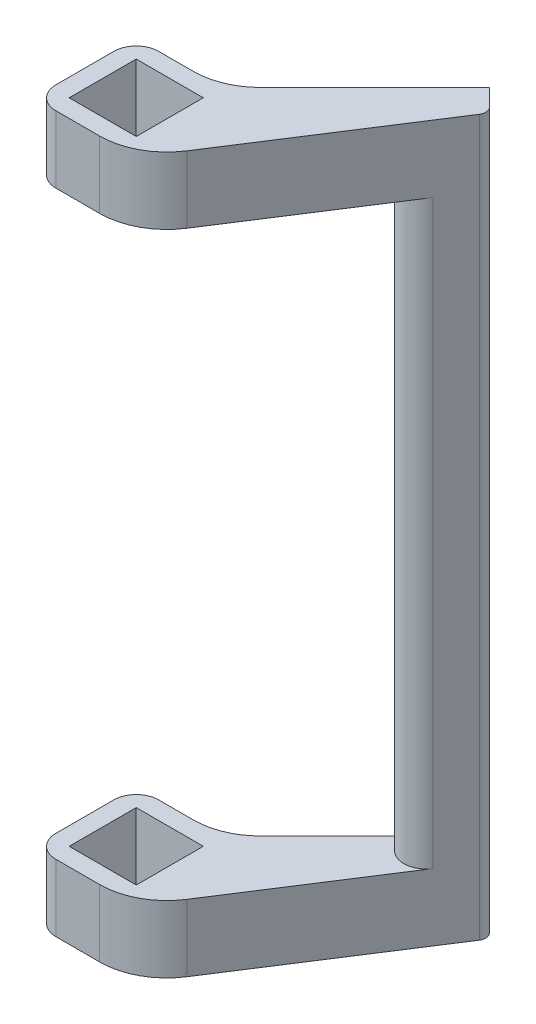
ISO-10303-21;
HEADER;
FILE_DESCRIPTION(('STEP AP214'),'2;1');
FILE_NAME('part.step','',(''),(''),'','','');
FILE_SCHEMA(('AUTOMOTIVE_DESIGN { 1 0 10303 214 1 1 1 1 }'));
ENDSEC;
DATA;
#1=APPLICATION_CONTEXT('core data for automotive mechanical design processes');
#2=APPLICATION_PROTOCOL_DEFINITION('international standard','automotive_design',2000,#1);
#3=PRODUCT_CONTEXT('',#1,'mechanical');
#4=PRODUCT('Part','Part','',(#3));
#5=PRODUCT_RELATED_PRODUCT_CATEGORY('part','',(#4));
#6=PRODUCT_DEFINITION_FORMATION('','',#4);
#7=PRODUCT_DEFINITION_CONTEXT('part definition',#1,'design');
#8=PRODUCT_DEFINITION('design','',#6,#7);
#9=PRODUCT_DEFINITION_SHAPE('','',#8);
#10=(LENGTH_UNIT() NAMED_UNIT(*) SI_UNIT(.MILLI.,.METRE.));
#11=(NAMED_UNIT(*) PLANE_ANGLE_UNIT() SI_UNIT($,.RADIAN.));
#12=(NAMED_UNIT(*) SI_UNIT($,.STERADIAN.) SOLID_ANGLE_UNIT());
#13=UNCERTAINTY_MEASURE_WITH_UNIT(LENGTH_MEASURE(1.E-05),#10,'distance_accuracy_value','');
#14=(GEOMETRIC_REPRESENTATION_CONTEXT(3) GLOBAL_UNCERTAINTY_ASSIGNED_CONTEXT((#13)) GLOBAL_UNIT_ASSIGNED_CONTEXT((#10,
#11,#12)) REPRESENTATION_CONTEXT('',''));
#15=CARTESIAN_POINT('',(0.,0.,0.));
#16=DIRECTION('',(0.,0.,1.));
#17=DIRECTION('',(1.,0.,0.));
#18=AXIS2_PLACEMENT_3D('',#15,#16,#17);
#19=CARTESIAN_POINT('',(40.3284271247369,159.,-38.6715728752495));
#20=DIRECTION('',(-0.707106781186547,0.,-0.707106781186547));
#21=DIRECTION('',(-0.707106781186548,0.,0.707106781186548));
#22=AXIS2_PLACEMENT_3D('',#19,#20,#21);
#23=PLANE('',#22);
#24=DIRECTION('',(0.,-1.,0.));
#25=VECTOR('',#24,1.);
#26=CARTESIAN_POINT('',(40.3284271247369,159.,-38.6715728752495));
#27=LINE('',#26,#25);
#28=CARTESIAN_POINT('',(40.3284271247369,145.,-38.6715728752495));
#29=VERTEX_POINT('',#28);
#30=CARTESIAN_POINT('',(40.3284271247437,15.,-38.6715728752563));
#31=VERTEX_POINT('',#30);
#32=EDGE_CURVE('E405',#29,#31,#27,.T.);
#33=ORIENTED_EDGE('',*,*,#32,.T.);
#34=DIRECTION('',(-0.707106781186548,0.,0.707106781186548));
#35=VECTOR('',#34,1.);
#36=CARTESIAN_POINT('',(40.3284271247369,15.,-38.6715728752495));
#37=LINE('',#36,#35);
#38=CARTESIAN_POINT('',(29.7218254069386,15.,-28.0649711574512));
#39=VERTEX_POINT('',#38);
#40=EDGE_CURVE('E394',#31,#39,#37,.T.);
#41=ORIENTED_EDGE('',*,*,#40,.T.);
#42=DIRECTION('',(0.,-1.,0.));
#43=VECTOR('',#42,1.);
#44=CARTESIAN_POINT('',(29.7218254069386,159.,-28.0649711574512));
#45=LINE('',#44,#43);
#46=CARTESIAN_POINT('',(29.7218254069386,145.,-28.0649711574512));
#47=VERTEX_POINT('',#46);
#48=EDGE_CURVE('E404',#47,#39,#45,.T.);
#49=ORIENTED_EDGE('',*,*,#48,.F.);
#50=DIRECTION('',(-0.707106781186548,0.,0.707106781186548));
#51=VECTOR('',#50,1.);
#52=CARTESIAN_POINT('',(20.352847396408,145.,-18.6959931469206));
#53=LINE('',#52,#51);
#54=EDGE_CURVE('E560',#29,#47,#53,.T.);
#55=ORIENTED_EDGE('',*,*,#54,.F.);
#56=EDGE_LOOP('',(#33,#41,#49,#55));
#57=FACE_BOUND('',#56,.T.);
#58=ADVANCED_FACE('F73',(#57),#23,.T.);
#59=CARTESIAN_POINT('',(29.7218254069386,159.,-28.0649711574512));
#60=DIRECTION('',(-0.707106781186549,0.,0.707106781186546));
#61=DIRECTION('',(0.707106781186546,0.,0.707106781186549));
#62=AXIS2_PLACEMENT_3D('',#59,#60,#61);
#63=PLANE('',#62);
#64=DIRECTION('',(0.707106781186546,0.,0.707106781186549));
#65=VECTOR('',#64,1.);
#66=CARTESIAN_POINT('',(29.7218254069386,15.,-28.0649711574512));
#67=LINE('',#66,#65);
#68=CARTESIAN_POINT('',(29.7563479415347,15.,-28.0304486228552));
#69=VERTEX_POINT('',#68);
#70=EDGE_CURVE('E564',#39,#69,#67,.T.);
#71=ORIENTED_EDGE('',*,*,#70,.T.);
#72=DIRECTION('',(0.,-1.,0.));
#73=VECTOR('',#72,1.);
#74=CARTESIAN_POINT('',(29.7563479415347,145.,-28.0304486228552));
#75=LINE('',#74,#73);
#76=CARTESIAN_POINT('',(29.7563479415347,145.,-28.0304486228552));
#77=VERTEX_POINT('',#76);
#78=EDGE_CURVE('E572',#69,#77,#75,.F.);
#79=ORIENTED_EDGE('',*,*,#78,.T.);
#80=DIRECTION('',(0.707106781186546,0.,0.707106781186549));
#81=VECTOR('',#80,1.);
#82=CARTESIAN_POINT('',(71.9178185538592,145.,14.1310219894695));
#83=LINE('',#82,#81);
#84=EDGE_CURVE('E556',#47,#77,#83,.T.);
#85=ORIENTED_EDGE('',*,*,#84,.F.);
#86=ORIENTED_EDGE('',*,*,#48,.T.);
#87=EDGE_LOOP('',(#71,#79,#85,#86));
#88=FACE_BOUND('',#87,.T.);
#89=ADVANCED_FACE('F668',(#88),#63,.T.);
#90=CARTESIAN_POINT('',(-11.5,160.,-11.5));
#91=DIRECTION('',(0.,0.,-1.));
#92=DIRECTION('',(-1.,0.,0.));
#93=AXIS2_PLACEMENT_3D('',#90,#91,#92);
#94=PLANE('',#93);
#95=DIRECTION('',(1.,0.,0.));
#96=VECTOR('',#95,1.);
#97=CARTESIAN_POINT('',(-11.5,160.,-11.5));
#98=LINE('',#97,#96);
#99=CARTESIAN_POINT('',(-6.5,160.,-11.5));
#100=VERTEX_POINT('',#99);
#101=CARTESIAN_POINT('',(1.28679656440358,160.,-11.5));
#102=VERTEX_POINT('',#101);
#103=EDGE_CURVE('E409',#100,#102,#98,.T.);
#104=ORIENTED_EDGE('',*,*,#103,.T.);
#105=DIRECTION('',(0.,-1.,0.));
#106=VECTOR('',#105,1.);
#107=CARTESIAN_POINT('',(1.28679656440358,145.,-11.5));
#108=LINE('',#107,#106);
#109=CARTESIAN_POINT('',(1.28679656440358,145.,-11.5));
#110=VERTEX_POINT('',#109);
#111=EDGE_CURVE('E543',#102,#110,#108,.T.);
#112=ORIENTED_EDGE('',*,*,#111,.T.);
#113=DIRECTION('',(1.,0.,0.));
#114=VECTOR('',#113,1.);
#115=CARTESIAN_POINT('',(-11.5,145.,-11.5));
#116=LINE('',#115,#114);
#117=CARTESIAN_POINT('',(-6.5,145.,-11.5));
#118=VERTEX_POINT('',#117);
#119=EDGE_CURVE('E450',#118,#110,#116,.T.);
#120=ORIENTED_EDGE('',*,*,#119,.F.);
#121=DIRECTION('',(0.,-1.,0.));
#122=VECTOR('',#121,1.);
#123=CARTESIAN_POINT('',(-6.5,160.,-11.5));
#124=LINE('',#123,#122);
#125=EDGE_CURVE('E517',#118,#100,#124,.F.);
#126=ORIENTED_EDGE('',*,*,#125,.T.);
#127=EDGE_LOOP('',(#104,#112,#120,#126));
#128=FACE_BOUND('',#127,.T.);
#129=ADVANCED_FACE('F634',(#128),#94,.T.);
#130=CARTESIAN_POINT('',(-11.5,160.,11.5));
#131=DIRECTION('',(-1.,0.,0.));
#132=DIRECTION('',(0.,0.,1.));
#133=AXIS2_PLACEMENT_3D('',#130,#131,#132);
#134=PLANE('',#133);
#135=DIRECTION('',(0.,0.,-1.));
#136=VECTOR('',#135,1.);
#137=CARTESIAN_POINT('',(-11.5,160.,11.5));
#138=LINE('',#137,#136);
#139=CARTESIAN_POINT('',(-11.5,160.,6.5));
#140=VERTEX_POINT('',#139);
#141=CARTESIAN_POINT('',(-11.5,160.,-6.5));
#142=VERTEX_POINT('',#141);
#143=EDGE_CURVE('E419',#140,#142,#138,.T.);
#144=ORIENTED_EDGE('',*,*,#143,.T.);
#145=DIRECTION('',(0.,-1.,0.));
#146=VECTOR('',#145,1.);
#147=CARTESIAN_POINT('',(-11.5,160.,-6.5));
#148=LINE('',#147,#146);
#149=CARTESIAN_POINT('',(-11.5,145.,-6.5));
#150=VERTEX_POINT('',#149);
#151=EDGE_CURVE('E507',#142,#150,#148,.T.);
#152=ORIENTED_EDGE('',*,*,#151,.T.);
#153=DIRECTION('',(0.,0.,-1.));
#154=VECTOR('',#153,1.);
#155=CARTESIAN_POINT('',(-11.5,145.,11.5));
#156=LINE('',#155,#154);
#157=CARTESIAN_POINT('',(-11.5,145.,6.5));
#158=VERTEX_POINT('',#157);
#159=EDGE_CURVE('E463',#158,#150,#156,.T.);
#160=ORIENTED_EDGE('',*,*,#159,.F.);
#161=DIRECTION('',(0.,-1.,0.));
#162=VECTOR('',#161,1.);
#163=CARTESIAN_POINT('',(-11.5,160.,6.5));
#164=LINE('',#163,#162);
#165=EDGE_CURVE('E484',#158,#140,#164,.F.);
#166=ORIENTED_EDGE('',*,*,#165,.T.);
#167=EDGE_LOOP('',(#144,#152,#160,#166));
#168=FACE_BOUND('',#167,.T.);
#169=ADVANCED_FACE('F642',(#168),#134,.T.);
#170=CARTESIAN_POINT('',(-11.5,160.,11.5));
#171=DIRECTION('',(0.,0.,-1.));
#172=DIRECTION('',(-1.,0.,0.));
#173=AXIS2_PLACEMENT_3D('',#170,#171,#172);
#174=PLANE('',#173);
#175=DIRECTION('',(1.,0.,0.));
#176=VECTOR('',#175,1.);
#177=CARTESIAN_POINT('',(-11.5,145.,11.5));
#178=LINE('',#177,#176);
#179=CARTESIAN_POINT('',(-6.5,145.,11.5));
#180=VERTEX_POINT('',#179);
#181=CARTESIAN_POINT('',(3.31936949857782,145.,11.5));
#182=VERTEX_POINT('',#181);
#183=EDGE_CURVE('E423',#180,#182,#178,.T.);
#184=ORIENTED_EDGE('',*,*,#183,.T.);
#185=DIRECTION('',(0.,-1.,0.));
#186=VECTOR('',#185,1.);
#187=CARTESIAN_POINT('',(3.31936949857782,160.,11.5));
#188=LINE('',#187,#186);
#189=CARTESIAN_POINT('',(3.31936949857782,160.,11.5));
#190=VERTEX_POINT('',#189);
#191=EDGE_CURVE('E537',#182,#190,#188,.F.);
#192=ORIENTED_EDGE('',*,*,#191,.T.);
#193=DIRECTION('',(1.,0.,0.));
#194=VECTOR('',#193,1.);
#195=CARTESIAN_POINT('',(-11.5,160.,11.5));
#196=LINE('',#195,#194);
#197=CARTESIAN_POINT('',(-6.5,160.,11.5));
#198=VERTEX_POINT('',#197);
#199=EDGE_CURVE('E417',#198,#190,#196,.T.);
#200=ORIENTED_EDGE('',*,*,#199,.F.);
#201=DIRECTION('',(0.,-1.,0.));
#202=VECTOR('',#201,1.);
#203=CARTESIAN_POINT('',(-6.5,145.,11.5));
#204=LINE('',#203,#202);
#205=EDGE_CURVE('E526',#198,#180,#204,.T.);
#206=ORIENTED_EDGE('',*,*,#205,.T.);
#207=EDGE_LOOP('',(#184,#192,#200,#206));
#208=FACE_BOUND('',#207,.T.);
#209=ADVANCED_FACE('F652',(#208),#174,.F.);
#210=CARTESIAN_POINT('',(11.5,160.,11.5));
#211=DIRECTION('',(-0.840698246814108,0.,-0.541503885308024));
#212=DIRECTION('',(-0.541503885308024,0.,0.840698246814108));
#213=AXIS2_PLACEMENT_3D('',#210,#211,#212);
#214=PLANE('',#213);
#215=DIRECTION('',(-0.541503885308023,0.,0.840698246814108));
#216=VECTOR('',#215,1.);
#217=CARTESIAN_POINT('',(34.1390729198763,0.,-23.6477236445135));
#218=LINE('',#217,#216);
#219=CARTESIAN_POINT('',(41.5760876533907,0.,-35.1938739448752));
#220=VERTEX_POINT('',#219);
#221=CARTESIAN_POINT('',(15.9298432007894,0.,4.62255827962036));
#222=VERTEX_POINT('',#221);
#223=EDGE_CURVE('E398',#220,#222,#218,.T.);
#224=ORIENTED_EDGE('',*,*,#223,.F.);
#225=DIRECTION('',(0.,-1.,0.));
#226=VECTOR('',#225,1.);
#227=CARTESIAN_POINT('',(41.5760876533907,160.,-35.1938739448752));
#228=LINE('',#227,#226);
#229=CARTESIAN_POINT('',(41.5760876533907,160.,-35.1938739448752));
#230=VERTEX_POINT('',#229);
#231=EDGE_CURVE('E82',#220,#230,#228,.F.);
#232=ORIENTED_EDGE('',*,*,#231,.T.);
#233=DIRECTION('',(0.541503885308024,0.,-0.840698246814108));
#234=VECTOR('',#233,1.);
#235=CARTESIAN_POINT('',(11.5,160.,11.5));
#236=LINE('',#235,#234);
#237=CARTESIAN_POINT('',(15.9298432007894,160.,4.62255827962036));
#238=VERTEX_POINT('',#237);
#239=EDGE_CURVE('E427',#238,#230,#236,.T.);
#240=ORIENTED_EDGE('',*,*,#239,.F.);
#241=DIRECTION('',(0.,-1.,0.));
#242=VECTOR('',#241,1.);
#243=CARTESIAN_POINT('',(15.9298432007894,160.,4.62255827962035));
#244=LINE('',#243,#242);
#245=CARTESIAN_POINT('',(15.9298432007894,145.,4.62255827962035));
#246=VERTEX_POINT('',#245);
#247=EDGE_CURVE('E530',#238,#246,#244,.T.);
#248=ORIENTED_EDGE('',*,*,#247,.T.);
#249=DIRECTION('',(0.541503885308024,0.,-0.840698246814108));
#250=VECTOR('',#249,1.);
#251=CARTESIAN_POINT('',(11.5,145.,11.5));
#252=LINE('',#251,#250);
#253=CARTESIAN_POINT('',(37.495373081538,145.,-28.8584631022478));
#254=VERTEX_POINT('',#253);
#255=EDGE_CURVE('E436',#246,#254,#252,.T.);
#256=ORIENTED_EDGE('',*,*,#255,.T.);
#257=DIRECTION('',(0.,-1.,0.));
#258=VECTOR('',#257,1.);
#259=CARTESIAN_POINT('',(37.495373081538,15.0000000000001,-28.8584631022478));
#260=LINE('',#259,#258);
#261=CARTESIAN_POINT('',(37.495373081538,15.,-28.8584631022478));
#262=VERTEX_POINT('',#261);
#263=EDGE_CURVE('E568',#254,#262,#260,.T.);
#264=ORIENTED_EDGE('',*,*,#263,.T.);
#265=DIRECTION('',(-0.541503885308024,0.,0.840698246814108));
#266=VECTOR('',#265,1.);
#267=CARTESIAN_POINT('',(11.5,15.,11.5));
#268=LINE('',#267,#266);
#269=CARTESIAN_POINT('',(15.9298432007894,15.,4.62255827962035));
#270=VERTEX_POINT('',#269);
#271=EDGE_CURVE('E611',#262,#270,#268,.T.);
#272=ORIENTED_EDGE('',*,*,#271,.T.);
#273=DIRECTION('',(0.,-1.,0.));
#274=VECTOR('',#273,1.);
#275=CARTESIAN_POINT('',(15.9298432007894,160.,4.62255827962035));
#276=LINE('',#275,#274);
#277=EDGE_CURVE('E367',#270,#222,#276,.T.);
#278=ORIENTED_EDGE('',*,*,#277,.T.);
#279=EDGE_LOOP('',(#224,#232,#240,#248,#256,#264,#272,#278));
#280=FACE_BOUND('',#279,.T.);
#281=ADVANCED_FACE('F659',(#280),#214,.F.);
#282=CARTESIAN_POINT('',(37.5,160.,-41.5));
#283=DIRECTION('',(0.707106781186548,0.,-0.707106781186548));
#284=DIRECTION('',(-0.707106781186548,0.,-0.707106781186548));
#285=AXIS2_PLACEMENT_3D('',#282,#283,#284);
#286=PLANE('',#285);
#287=DIRECTION('',(0.707106781186548,0.,0.707106781186548));
#288=VECTOR('',#287,1.);
#289=CARTESIAN_POINT('',(37.5,160.,-41.5));
#290=LINE('',#289,#288);
#291=CARTESIAN_POINT('',(37.5,160.,-41.5));
#292=VERTEX_POINT('',#291);
#293=CARTESIAN_POINT('',(41.3089047221356,160.,-37.6910952778644));
#294=VERTEX_POINT('',#293);
#295=EDGE_CURVE('E431',#292,#294,#290,.T.);
#296=ORIENTED_EDGE('',*,*,#295,.T.);
#297=DIRECTION('',(0.,-1.,0.));
#298=VECTOR('',#297,1.);
#299=CARTESIAN_POINT('',(41.3089047221356,0.,-37.6910952778644));
#300=LINE('',#299,#298);
#301=CARTESIAN_POINT('',(41.3089047221288,0.,-37.6910952778575));
#302=VERTEX_POINT('',#301);
#303=EDGE_CURVE('E582',#294,#302,#300,.T.);
#304=ORIENTED_EDGE('',*,*,#303,.T.);
#305=DIRECTION('',(0.707106781186547,0.,0.707106781186547));
#306=VECTOR('',#305,1.);
#307=CARTESIAN_POINT('',(42.4497474683005,0.,-36.5502525316859));
#308=LINE('',#307,#306);
#309=CARTESIAN_POINT('',(37.5,0.,-41.5));
#310=VERTEX_POINT('',#309);
#311=EDGE_CURVE('E401',#310,#302,#308,.T.);
#312=ORIENTED_EDGE('',*,*,#311,.F.);
#313=DIRECTION('',(0.,-1.,0.));
#314=VECTOR('',#313,1.);
#315=CARTESIAN_POINT('',(37.5,160.,-41.5));
#316=LINE('',#315,#314);
#317=CARTESIAN_POINT('',(37.5,15.,-41.5));
#318=VERTEX_POINT('',#317);
#319=EDGE_CURVE('E293',#318,#310,#316,.T.);
#320=ORIENTED_EDGE('',*,*,#319,.F.);
#321=DIRECTION('',(-0.707106781186548,0.,-0.707106781186548));
#322=VECTOR('',#321,1.);
#323=CARTESIAN_POINT('',(37.5,15.,-41.5));
#324=LINE('',#323,#322);
#325=EDGE_CURVE('E607',#31,#318,#324,.T.);
#326=ORIENTED_EDGE('',*,*,#325,.F.);
#327=ORIENTED_EDGE('',*,*,#32,.F.);
#328=DIRECTION('',(0.707106781186548,0.,0.707106781186548));
#329=VECTOR('',#328,1.);
#330=CARTESIAN_POINT('',(37.5,145.,-41.5));
#331=LINE('',#330,#329);
#332=CARTESIAN_POINT('',(37.5,145.,-41.5));
#333=VERTEX_POINT('',#332);
#334=EDGE_CURVE('E468',#333,#29,#331,.T.);
#335=ORIENTED_EDGE('',*,*,#334,.F.);
#336=DIRECTION('',(0.,-1.,0.));
#337=VECTOR('',#336,1.);
#338=CARTESIAN_POINT('',(37.5,160.,-41.5));
#339=LINE('',#338,#337);
#340=EDGE_CURVE('E439',#292,#333,#339,.T.);
#341=ORIENTED_EDGE('',*,*,#340,.F.);
#342=EDGE_LOOP('',(#296,#304,#312,#320,#326,#327,#335,#341));
#343=FACE_BOUND('',#342,.T.);
#344=ADVANCED_FACE('F590',(#343),#286,.T.);
#345=CARTESIAN_POINT('',(7.5,160.,-11.5));
#346=DIRECTION('',(-0.707106781186548,0.,-0.707106781186548));
#347=DIRECTION('',(-0.707106781186548,0.,0.707106781186548));
#348=AXIS2_PLACEMENT_3D('',#345,#346,#347);
#349=PLANE('',#348);
#350=DIRECTION('',(0.707106781186548,0.,-0.707106781186548));
#351=VECTOR('',#350,1.);
#352=CARTESIAN_POINT('',(7.5,145.,-11.5));
#353=LINE('',#352,#351);
#354=CARTESIAN_POINT('',(11.8933982822018,145.,-15.8933982822018));
#355=VERTEX_POINT('',#354);
#356=EDGE_CURVE('E462',#355,#333,#353,.T.);
#357=ORIENTED_EDGE('',*,*,#356,.F.);
#358=DIRECTION('',(0.,-1.,0.));
#359=VECTOR('',#358,1.);
#360=CARTESIAN_POINT('',(11.8933982822018,160.,-15.8933982822018));
#361=LINE('',#360,#359);
#362=CARTESIAN_POINT('',(11.8933982822018,160.,-15.8933982822018));
#363=VERTEX_POINT('',#362);
#364=EDGE_CURVE('E547',#355,#363,#361,.F.);
#365=ORIENTED_EDGE('',*,*,#364,.T.);
#366=DIRECTION('',(0.707106781186548,0.,-0.707106781186548));
#367=VECTOR('',#366,1.);
#368=CARTESIAN_POINT('',(7.5,160.,-11.5));
#369=LINE('',#368,#367);
#370=EDGE_CURVE('E435',#363,#292,#369,.T.);
#371=ORIENTED_EDGE('',*,*,#370,.T.);
#372=ORIENTED_EDGE('',*,*,#340,.T.);
#373=EDGE_LOOP('',(#357,#365,#371,#372));
#374=FACE_BOUND('',#373,.T.);
#375=ADVANCED_FACE('F621',(#374),#349,.T.);
#376=CARTESIAN_POINT('',(0.,160.,7.5));
#377=DIRECTION('',(0.,0.,-1.));
#378=DIRECTION('',(-1.,0.,0.));
#379=AXIS2_PLACEMENT_3D('',#376,#377,#378);
#380=PLANE('',#379);
#381=DIRECTION('',(1.,0.,0.));
#382=VECTOR('',#381,1.);
#383=CARTESIAN_POINT('',(0.,145.,7.5));
#384=LINE('',#383,#382);
#385=CARTESIAN_POINT('',(-7.5,145.,7.5));
#386=VERTEX_POINT('',#385);
#387=CARTESIAN_POINT('',(7.5,145.,7.5));
#388=VERTEX_POINT('',#387);
#389=EDGE_CURVE('E467',#386,#388,#384,.T.);
#390=ORIENTED_EDGE('',*,*,#389,.F.);
#391=DIRECTION('',(0.,-1.,0.));
#392=VECTOR('',#391,1.);
#393=CARTESIAN_POINT('',(-7.5,160.,7.5));
#394=LINE('',#393,#392);
#395=CARTESIAN_POINT('',(-7.5,160.,7.5));
#396=VERTEX_POINT('',#395);
#397=EDGE_CURVE('E418',#396,#386,#394,.T.);
#398=ORIENTED_EDGE('',*,*,#397,.F.);
#399=DIRECTION('',(1.,0.,0.));
#400=VECTOR('',#399,1.);
#401=CARTESIAN_POINT('',(0.,160.,7.5));
#402=LINE('',#401,#400);
#403=CARTESIAN_POINT('',(7.5,160.,7.5));
#404=VERTEX_POINT('',#403);
#405=EDGE_CURVE('E456',#396,#404,#402,.T.);
#406=ORIENTED_EDGE('',*,*,#405,.T.);
#407=DIRECTION('',(0.,-1.,0.));
#408=VECTOR('',#407,1.);
#409=CARTESIAN_POINT('',(7.5,160.,7.5));
#410=LINE('',#409,#408);
#411=EDGE_CURVE('E455',#404,#388,#410,.T.);
#412=ORIENTED_EDGE('',*,*,#411,.T.);
#413=EDGE_LOOP('',(#390,#398,#406,#412));
#414=FACE_BOUND('',#413,.T.);
#415=ADVANCED_FACE('F685',(#414),#380,.T.);
#416=CARTESIAN_POINT('',(7.5,160.,0.));
#417=DIRECTION('',(-1.,0.,0.));
#418=DIRECTION('',(0.,0.,1.));
#419=AXIS2_PLACEMENT_3D('',#416,#417,#418);
#420=PLANE('',#419);
#421=DIRECTION('',(0.,0.,-1.));
#422=VECTOR('',#421,1.);
#423=CARTESIAN_POINT('',(7.5,145.,0.));
#424=LINE('',#423,#422);
#425=CARTESIAN_POINT('',(7.5,145.,-7.5));
#426=VERTEX_POINT('',#425);
#427=EDGE_CURVE('E481',#388,#426,#424,.T.);
#428=ORIENTED_EDGE('',*,*,#427,.F.);
#429=ORIENTED_EDGE('',*,*,#411,.F.);
#430=DIRECTION('',(0.,0.,-1.));
#431=VECTOR('',#430,1.);
#432=CARTESIAN_POINT('',(7.5,160.,0.));
#433=LINE('',#432,#431);
#434=CARTESIAN_POINT('',(7.5,160.,-7.5));
#435=VERTEX_POINT('',#434);
#436=EDGE_CURVE('E451',#404,#435,#433,.T.);
#437=ORIENTED_EDGE('',*,*,#436,.T.);
#438=DIRECTION('',(0.,-1.,0.));
#439=VECTOR('',#438,1.);
#440=CARTESIAN_POINT('',(7.5,160.,-7.5));
#441=LINE('',#440,#439);
#442=EDGE_CURVE('E454',#435,#426,#441,.T.);
#443=ORIENTED_EDGE('',*,*,#442,.T.);
#444=EDGE_LOOP('',(#428,#429,#437,#443));
#445=FACE_BOUND('',#444,.T.);
#446=ADVANCED_FACE('F702',(#445),#420,.T.);
#447=CARTESIAN_POINT('',(0.,160.,-7.5));
#448=DIRECTION('',(0.,0.,-1.));
#449=DIRECTION('',(-1.,0.,0.));
#450=AXIS2_PLACEMENT_3D('',#447,#448,#449);
#451=PLANE('',#450);
#452=DIRECTION('',(0.,-1.,0.));
#453=VECTOR('',#452,1.);
#454=CARTESIAN_POINT('',(-7.5,160.,-7.5));
#455=LINE('',#454,#453);
#456=CARTESIAN_POINT('',(-7.5,160.,-7.5));
#457=VERTEX_POINT('',#456);
#458=CARTESIAN_POINT('',(-7.5,145.,-7.5));
#459=VERTEX_POINT('',#458);
#460=EDGE_CURVE('E489',#457,#459,#455,.T.);
#461=ORIENTED_EDGE('',*,*,#460,.T.);
#462=DIRECTION('',(1.,0.,0.));
#463=VECTOR('',#462,1.);
#464=CARTESIAN_POINT('',(0.,145.,-7.5));
#465=LINE('',#464,#463);
#466=EDGE_CURVE('E485',#459,#426,#465,.T.);
#467=ORIENTED_EDGE('',*,*,#466,.T.);
#468=ORIENTED_EDGE('',*,*,#442,.F.);
#469=DIRECTION('',(1.,0.,0.));
#470=VECTOR('',#469,1.);
#471=CARTESIAN_POINT('',(0.,160.,-7.5));
#472=LINE('',#471,#470);
#473=EDGE_CURVE('E446',#457,#435,#472,.T.);
#474=ORIENTED_EDGE('',*,*,#473,.F.);
#475=EDGE_LOOP('',(#461,#467,#468,#474));
#476=FACE_BOUND('',#475,.T.);
#477=ADVANCED_FACE('F698',(#476),#451,.F.);
#478=CARTESIAN_POINT('',(-7.5,160.,0.));
#479=DIRECTION('',(-1.,0.,0.));
#480=DIRECTION('',(0.,0.,1.));
#481=AXIS2_PLACEMENT_3D('',#478,#479,#480);
#482=PLANE('',#481);
#483=ORIENTED_EDGE('',*,*,#397,.T.);
#484=DIRECTION('',(0.,0.,-1.));
#485=VECTOR('',#484,1.);
#486=CARTESIAN_POINT('',(-7.5,145.,0.));
#487=LINE('',#486,#485);
#488=EDGE_CURVE('E413',#386,#459,#487,.T.);
#489=ORIENTED_EDGE('',*,*,#488,.T.);
#490=ORIENTED_EDGE('',*,*,#460,.F.);
#491=DIRECTION('',(0.,0.,-1.));
#492=VECTOR('',#491,1.);
#493=CARTESIAN_POINT('',(-7.5,160.,0.));
#494=LINE('',#493,#492);
#495=EDGE_CURVE('E430',#396,#457,#494,.T.);
#496=ORIENTED_EDGE('',*,*,#495,.F.);
#497=EDGE_LOOP('',(#483,#489,#490,#496));
#498=FACE_BOUND('',#497,.T.);
#499=ADVANCED_FACE('F680',(#498),#482,.F.);
#500=CARTESIAN_POINT('',(0.,160.,0.));
#501=DIRECTION('',(0.,1.,0.));
#502=DIRECTION('',(0.,0.,1.));
#503=AXIS2_PLACEMENT_3D('',#500,#501,#502);
#504=PLANE('',#503);
#505=ORIENTED_EDGE('',*,*,#239,.T.);
#506=CARTESIAN_POINT('',(39.8946911597625,160.,-36.2768817154913));
#507=DIRECTION('',(0.,1.,0.));
#508=DIRECTION('',(0.,0.,1.));
#509=AXIS2_PLACEMENT_3D('',#506,#507,#508);
#510=CIRCLE('',#509,2.);
#511=EDGE_CURVE('E12',#230,#294,#510,.T.);
#512=ORIENTED_EDGE('',*,*,#511,.T.);
#513=ORIENTED_EDGE('',*,*,#295,.F.);
#514=ORIENTED_EDGE('',*,*,#370,.F.);
#515=CARTESIAN_POINT('',(1.28679656440358,160.,-26.5));
#516=DIRECTION('',(0.,1.,0.));
#517=DIRECTION('',(0.,0.,1.));
#518=AXIS2_PLACEMENT_3D('',#515,#516,#517);
#519=CIRCLE('',#518,15.);
#520=EDGE_CURVE('E553',#363,#102,#519,.F.);
#521=ORIENTED_EDGE('',*,*,#520,.T.);
#522=ORIENTED_EDGE('',*,*,#103,.F.);
#523=CARTESIAN_POINT('',(-6.5,160.,-6.5));
#524=DIRECTION('',(0.,1.,0.));
#525=DIRECTION('',(0.,0.,1.));
#526=AXIS2_PLACEMENT_3D('',#523,#524,#525);
#527=CIRCLE('',#526,5.);
#528=EDGE_CURVE('E523',#100,#142,#527,.T.);
#529=ORIENTED_EDGE('',*,*,#528,.T.);
#530=ORIENTED_EDGE('',*,*,#143,.F.);
#531=CARTESIAN_POINT('',(-6.5,160.,6.5));
#532=DIRECTION('',(0.,1.,0.));
#533=DIRECTION('',(0.,0.,1.));
#534=AXIS2_PLACEMENT_3D('',#531,#532,#533);
#535=CIRCLE('',#534,5.);
#536=EDGE_CURVE('E520',#140,#198,#535,.T.);
#537=ORIENTED_EDGE('',*,*,#536,.T.);
#538=ORIENTED_EDGE('',*,*,#199,.T.);
#539=CARTESIAN_POINT('',(3.31936949857782,160.,-3.5));
#540=DIRECTION('',(0.,1.,0.));
#541=DIRECTION('',(0.,0.,1.));
#542=AXIS2_PLACEMENT_3D('',#539,#540,#541);
#543=CIRCLE('',#542,15.);
#544=EDGE_CURVE('E540',#190,#238,#543,.T.);
#545=ORIENTED_EDGE('',*,*,#544,.T.);
#546=EDGE_LOOP('',(#505,#512,#513,#514,#521,#522,#529,#530,#537,#538,#545));
#547=FACE_BOUND('',#546,.T.);
#548=ORIENTED_EDGE('',*,*,#436,.F.);
#549=ORIENTED_EDGE('',*,*,#405,.F.);
#550=ORIENTED_EDGE('',*,*,#495,.T.);
#551=ORIENTED_EDGE('',*,*,#473,.T.);
#552=EDGE_LOOP('',(#548,#549,#550,#551));
#553=FACE_BOUND('',#552,.T.);
#554=ADVANCED_FACE('F626',(#547,#553),#504,.T.);
#555=CARTESIAN_POINT('',(62.5488405433287,145.,23.5));
#556=DIRECTION('',(0.,1.,0.));
#557=DIRECTION('',(0.,0.,1.));
#558=AXIS2_PLACEMENT_3D('',#555,#556,#557);
#559=PLANE('',#558);
#560=ORIENTED_EDGE('',*,*,#334,.T.);
#561=ORIENTED_EDGE('',*,*,#54,.T.);
#562=ORIENTED_EDGE('',*,*,#84,.T.);
#563=CARTESIAN_POINT('',(33.2918818474675,145.,-31.5659825287879));
#564=DIRECTION('',(0.,1.,0.));
#565=DIRECTION('',(0.,0.,1.));
#566=AXIS2_PLACEMENT_3D('',#563,#564,#565);
#567=CIRCLE('',#566,5.);
#568=EDGE_CURVE('E578',#77,#254,#567,.T.);
#569=ORIENTED_EDGE('',*,*,#568,.T.);
#570=ORIENTED_EDGE('',*,*,#255,.F.);
#571=CARTESIAN_POINT('',(3.31936949857782,145.,-3.5));
#572=DIRECTION('',(0.,1.,0.));
#573=DIRECTION('',(0.,0.,1.));
#574=AXIS2_PLACEMENT_3D('',#571,#572,#573);
#575=CIRCLE('',#574,15.);
#576=EDGE_CURVE('E534',#246,#182,#575,.F.);
#577=ORIENTED_EDGE('',*,*,#576,.T.);
#578=ORIENTED_EDGE('',*,*,#183,.F.);
#579=CARTESIAN_POINT('',(-6.5,145.,6.5));
#580=DIRECTION('',(0.,1.,0.));
#581=DIRECTION('',(0.,0.,1.));
#582=AXIS2_PLACEMENT_3D('',#579,#580,#581);
#583=CIRCLE('',#582,5.);
#584=EDGE_CURVE('E511',#180,#158,#583,.F.);
#585=ORIENTED_EDGE('',*,*,#584,.T.);
#586=ORIENTED_EDGE('',*,*,#159,.T.);
#587=CARTESIAN_POINT('',(-6.5,145.,-6.5));
#588=DIRECTION('',(0.,1.,0.));
#589=DIRECTION('',(0.,0.,1.));
#590=AXIS2_PLACEMENT_3D('',#587,#588,#589);
#591=CIRCLE('',#590,5.);
#592=EDGE_CURVE('E514',#150,#118,#591,.F.);
#593=ORIENTED_EDGE('',*,*,#592,.T.);
#594=ORIENTED_EDGE('',*,*,#119,.T.);
#595=CARTESIAN_POINT('',(1.28679656440358,145.,-26.5));
#596=DIRECTION('',(0.,1.,0.));
#597=DIRECTION('',(0.,0.,1.));
#598=AXIS2_PLACEMENT_3D('',#595,#596,#597);
#599=CIRCLE('',#598,15.);
#600=EDGE_CURVE('E550',#110,#355,#599,.T.);
#601=ORIENTED_EDGE('',*,*,#600,.T.);
#602=ORIENTED_EDGE('',*,*,#356,.T.);
#603=EDGE_LOOP('',(#560,#561,#562,#569,#570,#577,#578,#585,#586,#593,#594,#601,#602));
#604=FACE_BOUND('',#603,.T.);
#605=ORIENTED_EDGE('',*,*,#389,.T.);
#606=ORIENTED_EDGE('',*,*,#427,.T.);
#607=ORIENTED_EDGE('',*,*,#466,.F.);
#608=ORIENTED_EDGE('',*,*,#488,.F.);
#609=EDGE_LOOP('',(#605,#606,#607,#608));
#610=FACE_BOUND('',#609,.T.);
#611=ADVANCED_FACE('F616',(#604,#610),#559,.F.);
#612=CARTESIAN_POINT('',(-6.5,160.,-6.5));
#613=DIRECTION('',(0.,-1.,0.));
#614=DIRECTION('',(0.,0.,-1.));
#615=AXIS2_PLACEMENT_3D('',#612,#613,#614);
#616=CYLINDRICAL_SURFACE('',#615,5.);
#617=ORIENTED_EDGE('',*,*,#528,.F.);
#618=ORIENTED_EDGE('',*,*,#125,.F.);
#619=ORIENTED_EDGE('',*,*,#592,.F.);
#620=ORIENTED_EDGE('',*,*,#151,.F.);
#621=EDGE_LOOP('',(#617,#618,#619,#620));
#622=FACE_BOUND('',#621,.T.);
#623=ADVANCED_FACE('F640',(#622),#616,.T.);
#624=CARTESIAN_POINT('',(-6.5,160.,6.5));
#625=DIRECTION('',(0.,1.,0.));
#626=DIRECTION('',(0.,0.,1.));
#627=AXIS2_PLACEMENT_3D('',#624,#625,#626);
#628=CYLINDRICAL_SURFACE('',#627,5.);
#629=ORIENTED_EDGE('',*,*,#536,.F.);
#630=ORIENTED_EDGE('',*,*,#165,.F.);
#631=ORIENTED_EDGE('',*,*,#584,.F.);
#632=ORIENTED_EDGE('',*,*,#205,.F.);
#633=EDGE_LOOP('',(#629,#630,#631,#632));
#634=FACE_BOUND('',#633,.T.);
#635=ADVANCED_FACE('F649',(#634),#628,.T.);
#636=CARTESIAN_POINT('',(3.31936949857782,160.,-3.5));
#637=DIRECTION('',(0.,-1.,0.));
#638=DIRECTION('',(0.,0.,-1.));
#639=AXIS2_PLACEMENT_3D('',#636,#637,#638);
#640=CYLINDRICAL_SURFACE('',#639,15.);
#641=ORIENTED_EDGE('',*,*,#544,.F.);
#642=ORIENTED_EDGE('',*,*,#191,.F.);
#643=ORIENTED_EDGE('',*,*,#576,.F.);
#644=ORIENTED_EDGE('',*,*,#247,.F.);
#645=EDGE_LOOP('',(#641,#642,#643,#644));
#646=FACE_BOUND('',#645,.T.);
#647=ADVANCED_FACE('F658',(#646),#640,.T.);
#648=CARTESIAN_POINT('',(1.28679656440358,160.,-26.5));
#649=DIRECTION('',(0.,1.,0.));
#650=DIRECTION('',(0.,0.,1.));
#651=AXIS2_PLACEMENT_3D('',#648,#649,#650);
#652=CYLINDRICAL_SURFACE('',#651,15.);
#653=ORIENTED_EDGE('',*,*,#520,.F.);
#654=ORIENTED_EDGE('',*,*,#364,.F.);
#655=ORIENTED_EDGE('',*,*,#600,.F.);
#656=ORIENTED_EDGE('',*,*,#111,.F.);
#657=EDGE_LOOP('',(#653,#654,#655,#656));
#658=FACE_BOUND('',#657,.T.);
#659=ADVANCED_FACE('F631',(#658),#652,.F.);
#660=CARTESIAN_POINT('',(0.,0.,0.));
#661=DIRECTION('',(0.,1.,0.));
#662=DIRECTION('',(0.,0.,1.));
#663=AXIS2_PLACEMENT_3D('',#660,#661,#662);
#664=PLANE('',#663);
#665=ORIENTED_EDGE('',*,*,#311,.T.);
#666=CARTESIAN_POINT('',(39.8946911597625,0.,-36.2768817154913));
#667=DIRECTION('',(0.,1.,0.));
#668=DIRECTION('',(0.,0.,1.));
#669=AXIS2_PLACEMENT_3D('',#666,#667,#668);
#670=CIRCLE('',#669,2.);
#671=EDGE_CURVE('E96',#302,#220,#670,.F.);
#672=ORIENTED_EDGE('',*,*,#671,.T.);
#673=ORIENTED_EDGE('',*,*,#223,.T.);
#674=CARTESIAN_POINT('',(3.31936949857782,0.,-3.5));
#675=DIRECTION('',(0.,1.,0.));
#676=DIRECTION('',(0.,0.,1.));
#677=AXIS2_PLACEMENT_3D('',#674,#675,#676);
#678=CIRCLE('',#677,15.);
#679=CARTESIAN_POINT('',(3.31936949857782,0.,11.5));
#680=VERTEX_POINT('',#679);
#681=EDGE_CURVE('E371',#222,#680,#678,.F.);
#682=ORIENTED_EDGE('',*,*,#681,.T.);
#683=DIRECTION('',(1.,0.,0.));
#684=VECTOR('',#683,1.);
#685=CARTESIAN_POINT('',(-11.5,0.,11.5));
#686=LINE('',#685,#684);
#687=CARTESIAN_POINT('',(-6.5,0.,11.5));
#688=VERTEX_POINT('',#687);
#689=EDGE_CURVE('E329',#688,#680,#686,.T.);
#690=ORIENTED_EDGE('',*,*,#689,.F.);
#691=CARTESIAN_POINT('',(-6.5,0.,6.5));
#692=DIRECTION('',(0.,1.,0.));
#693=DIRECTION('',(0.,0.,1.));
#694=AXIS2_PLACEMENT_3D('',#691,#692,#693);
#695=CIRCLE('',#694,5.);
#696=CARTESIAN_POINT('',(-11.5,0.,6.5));
#697=VERTEX_POINT('',#696);
#698=EDGE_CURVE('E346',#688,#697,#695,.F.);
#699=ORIENTED_EDGE('',*,*,#698,.T.);
#700=DIRECTION('',(0.,0.,-1.));
#701=VECTOR('',#700,1.);
#702=CARTESIAN_POINT('',(-11.5,0.,11.5));
#703=LINE('',#702,#701);
#704=CARTESIAN_POINT('',(-11.5,0.,-6.5));
#705=VERTEX_POINT('',#704);
#706=EDGE_CURVE('E333',#697,#705,#703,.T.);
#707=ORIENTED_EDGE('',*,*,#706,.T.);
#708=CARTESIAN_POINT('',(-6.5,0.,-6.5));
#709=DIRECTION('',(0.,1.,0.));
#710=DIRECTION('',(0.,0.,1.));
#711=AXIS2_PLACEMENT_3D('',#708,#709,#710);
#712=CIRCLE('',#711,5.);
#713=CARTESIAN_POINT('',(-6.5,0.,-11.5));
#714=VERTEX_POINT('',#713);
#715=EDGE_CURVE('E349',#705,#714,#712,.F.);
#716=ORIENTED_EDGE('',*,*,#715,.T.);
#717=DIRECTION('',(1.,0.,0.));
#718=VECTOR('',#717,1.);
#719=CARTESIAN_POINT('',(-11.5,0.,-11.5));
#720=LINE('',#719,#718);
#721=CARTESIAN_POINT('',(1.28679656440358,0.,-11.5));
#722=VERTEX_POINT('',#721);
#723=EDGE_CURVE('E321',#714,#722,#720,.T.);
#724=ORIENTED_EDGE('',*,*,#723,.T.);
#725=CARTESIAN_POINT('',(1.28679656440358,0.,-26.5));
#726=DIRECTION('',(0.,1.,0.));
#727=DIRECTION('',(0.,0.,1.));
#728=AXIS2_PLACEMENT_3D('',#725,#726,#727);
#729=CIRCLE('',#728,15.);
#730=CARTESIAN_POINT('',(11.8933982822018,0.,-15.8933982822018));
#731=VERTEX_POINT('',#730);
#732=EDGE_CURVE('E388',#722,#731,#729,.T.);
#733=ORIENTED_EDGE('',*,*,#732,.T.);
#734=DIRECTION('',(0.707106781186548,0.,-0.707106781186548));
#735=VECTOR('',#734,1.);
#736=CARTESIAN_POINT('',(7.5,0.,-11.5));
#737=LINE('',#736,#735);
#738=EDGE_CURVE('E325',#731,#310,#737,.T.);
#739=ORIENTED_EDGE('',*,*,#738,.T.);
#740=EDGE_LOOP('',(#665,#672,#673,#682,#690,#699,#707,#716,#724,#733,#739));
#741=FACE_BOUND('',#740,.T.);
#742=DIRECTION('',(1.,0.,0.));
#743=VECTOR('',#742,1.);
#744=CARTESIAN_POINT('',(0.,0.,7.5));
#745=LINE('',#744,#743);
#746=CARTESIAN_POINT('',(-7.5,0.,7.5));
#747=VERTEX_POINT('',#746);
#748=CARTESIAN_POINT('',(7.5,0.,7.5));
#749=VERTEX_POINT('',#748);
#750=EDGE_CURVE('E760',#747,#749,#745,.T.);
#751=ORIENTED_EDGE('',*,*,#750,.T.);
#752=DIRECTION('',(0.,0.,-1.));
#753=VECTOR('',#752,1.);
#754=CARTESIAN_POINT('',(7.5,0.,0.));
#755=LINE('',#754,#753);
#756=CARTESIAN_POINT('',(7.5,0.,-7.5));
#757=VERTEX_POINT('',#756);
#758=EDGE_CURVE('E766',#749,#757,#755,.T.);
#759=ORIENTED_EDGE('',*,*,#758,.T.);
#760=DIRECTION('',(1.,0.,0.));
#761=VECTOR('',#760,1.);
#762=CARTESIAN_POINT('',(0.,0.,-7.5));
#763=LINE('',#762,#761);
#764=CARTESIAN_POINT('',(-7.5,0.,-7.5));
#765=VERTEX_POINT('',#764);
#766=EDGE_CURVE('E776',#765,#757,#763,.T.);
#767=ORIENTED_EDGE('',*,*,#766,.F.);
#768=DIRECTION('',(0.,0.,-1.));
#769=VECTOR('',#768,1.);
#770=CARTESIAN_POINT('',(-7.5,0.,0.));
#771=LINE('',#770,#769);
#772=EDGE_CURVE('E307',#747,#765,#771,.T.);
#773=ORIENTED_EDGE('',*,*,#772,.F.);
#774=EDGE_LOOP('',(#751,#759,#767,#773));
#775=FACE_BOUND('',#774,.T.);
#776=ADVANCED_FACE('F596',(#741,#775),#664,.F.);
#777=CARTESIAN_POINT('',(7.5,160.,-11.5));
#778=DIRECTION('',(-0.707106781186548,0.,-0.707106781186548));
#779=DIRECTION('',(-0.707106781186548,0.,0.707106781186548));
#780=AXIS2_PLACEMENT_3D('',#777,#778,#779);
#781=PLANE('',#780);
#782=ORIENTED_EDGE('',*,*,#738,.F.);
#783=DIRECTION('',(0.,-1.,0.));
#784=VECTOR('',#783,1.);
#785=CARTESIAN_POINT('',(11.8933982822018,15.,-15.8933982822018));
#786=LINE('',#785,#784);
#787=CARTESIAN_POINT('',(11.8933982822018,15.,-15.8933982822018));
#788=VERTEX_POINT('',#787);
#789=EDGE_CURVE('E385',#731,#788,#786,.F.);
#790=ORIENTED_EDGE('',*,*,#789,.T.);
#791=DIRECTION('',(-0.707106781186548,0.,0.707106781186548));
#792=VECTOR('',#791,1.);
#793=CARTESIAN_POINT('',(7.5,15.,-11.5));
#794=LINE('',#793,#792);
#795=EDGE_CURVE('E604',#318,#788,#794,.T.);
#796=ORIENTED_EDGE('',*,*,#795,.F.);
#797=ORIENTED_EDGE('',*,*,#319,.T.);
#798=EDGE_LOOP('',(#782,#790,#796,#797));
#799=FACE_BOUND('',#798,.T.);
#800=ADVANCED_FACE('F602',(#799),#781,.T.);
#801=CARTESIAN_POINT('',(-11.5,160.,11.5));
#802=DIRECTION('',(0.,0.,-1.));
#803=DIRECTION('',(-1.,0.,0.));
#804=AXIS2_PLACEMENT_3D('',#801,#802,#803);
#805=PLANE('',#804);
#806=ORIENTED_EDGE('',*,*,#689,.T.);
#807=DIRECTION('',(0.,-1.,0.));
#808=VECTOR('',#807,1.);
#809=CARTESIAN_POINT('',(3.31936949857782,160.,11.5));
#810=LINE('',#809,#808);
#811=CARTESIAN_POINT('',(3.31936949857782,15.,11.5));
#812=VERTEX_POINT('',#811);
#813=EDGE_CURVE('E374',#680,#812,#810,.F.);
#814=ORIENTED_EDGE('',*,*,#813,.T.);
#815=DIRECTION('',(-1.,0.,0.));
#816=VECTOR('',#815,1.);
#817=CARTESIAN_POINT('',(-11.5,15.,11.5));
#818=LINE('',#817,#816);
#819=CARTESIAN_POINT('',(-6.5,15.,11.5));
#820=VERTEX_POINT('',#819);
#821=EDGE_CURVE('E769',#812,#820,#818,.T.);
#822=ORIENTED_EDGE('',*,*,#821,.T.);
#823=DIRECTION('',(0.,-1.,0.));
#824=VECTOR('',#823,1.);
#825=CARTESIAN_POINT('',(-6.5,0.,11.5));
#826=LINE('',#825,#824);
#827=EDGE_CURVE('E363',#820,#688,#826,.T.);
#828=ORIENTED_EDGE('',*,*,#827,.T.);
#829=EDGE_LOOP('',(#806,#814,#822,#828));
#830=FACE_BOUND('',#829,.T.);
#831=ADVANCED_FACE('F723',(#830),#805,.F.);
#832=CARTESIAN_POINT('',(-11.5,160.,11.5));
#833=DIRECTION('',(-1.,0.,0.));
#834=DIRECTION('',(0.,0.,1.));
#835=AXIS2_PLACEMENT_3D('',#832,#833,#834);
#836=PLANE('',#835);
#837=DIRECTION('',(0.,0.,1.));
#838=VECTOR('',#837,1.);
#839=CARTESIAN_POINT('',(-11.5,15.,11.5));
#840=LINE('',#839,#838);
#841=CARTESIAN_POINT('',(-11.5,15.,-6.5));
#842=VERTEX_POINT('',#841);
#843=CARTESIAN_POINT('',(-11.5,15.,6.5));
#844=VERTEX_POINT('',#843);
#845=EDGE_CURVE('E761',#842,#844,#840,.T.);
#846=ORIENTED_EDGE('',*,*,#845,.F.);
#847=DIRECTION('',(0.,-1.,0.));
#848=VECTOR('',#847,1.);
#849=CARTESIAN_POINT('',(-11.5,160.,-6.5));
#850=LINE('',#849,#848);
#851=EDGE_CURVE('E342',#842,#705,#850,.T.);
#852=ORIENTED_EDGE('',*,*,#851,.T.);
#853=ORIENTED_EDGE('',*,*,#706,.F.);
#854=DIRECTION('',(0.,-1.,0.));
#855=VECTOR('',#854,1.);
#856=CARTESIAN_POINT('',(-11.5,15.,6.5));
#857=LINE('',#856,#855);
#858=EDGE_CURVE('E292',#697,#844,#857,.F.);
#859=ORIENTED_EDGE('',*,*,#858,.T.);
#860=EDGE_LOOP('',(#846,#852,#853,#859));
#861=FACE_BOUND('',#860,.T.);
#862=ADVANCED_FACE('F728',(#861),#836,.T.);
#863=CARTESIAN_POINT('',(-11.5,160.,-11.5));
#864=DIRECTION('',(0.,0.,-1.));
#865=DIRECTION('',(-1.,0.,0.));
#866=AXIS2_PLACEMENT_3D('',#863,#864,#865);
#867=PLANE('',#866);
#868=DIRECTION('',(-1.,0.,0.));
#869=VECTOR('',#868,1.);
#870=CARTESIAN_POINT('',(-11.5,15.,-11.5));
#871=LINE('',#870,#869);
#872=CARTESIAN_POINT('',(1.28679656440358,15.,-11.5));
#873=VERTEX_POINT('',#872);
#874=CARTESIAN_POINT('',(-6.5,15.,-11.5));
#875=VERTEX_POINT('',#874);
#876=EDGE_CURVE('E755',#873,#875,#871,.T.);
#877=ORIENTED_EDGE('',*,*,#876,.F.);
#878=DIRECTION('',(0.,-1.,0.));
#879=VECTOR('',#878,1.);
#880=CARTESIAN_POINT('',(1.28679656440358,0.,-11.5));
#881=LINE('',#880,#879);
#882=EDGE_CURVE('E381',#873,#722,#881,.T.);
#883=ORIENTED_EDGE('',*,*,#882,.T.);
#884=ORIENTED_EDGE('',*,*,#723,.F.);
#885=DIRECTION('',(0.,-1.,0.));
#886=VECTOR('',#885,1.);
#887=CARTESIAN_POINT('',(-6.5,160.,-11.5));
#888=LINE('',#887,#886);
#889=EDGE_CURVE('E352',#714,#875,#888,.F.);
#890=ORIENTED_EDGE('',*,*,#889,.T.);
#891=EDGE_LOOP('',(#877,#883,#884,#890));
#892=FACE_BOUND('',#891,.T.);
#893=ADVANCED_FACE('F733',(#892),#867,.T.);
#894=CARTESIAN_POINT('',(-7.5,160.,0.));
#895=DIRECTION('',(-1.,0.,0.));
#896=DIRECTION('',(0.,0.,1.));
#897=AXIS2_PLACEMENT_3D('',#894,#895,#896);
#898=PLANE('',#897);
#899=DIRECTION('',(0.,-1.,0.));
#900=VECTOR('',#899,1.);
#901=CARTESIAN_POINT('',(-7.5,160.,-7.5));
#902=LINE('',#901,#900);
#903=CARTESIAN_POINT('',(-7.5,15.,-7.5));
#904=VERTEX_POINT('',#903);
#905=EDGE_CURVE('E299',#904,#765,#902,.T.);
#906=ORIENTED_EDGE('',*,*,#905,.F.);
#907=DIRECTION('',(0.,0.,1.));
#908=VECTOR('',#907,1.);
#909=CARTESIAN_POINT('',(-7.5,15.,0.));
#910=LINE('',#909,#908);
#911=CARTESIAN_POINT('',(-7.5,15.,7.5));
#912=VERTEX_POINT('',#911);
#913=EDGE_CURVE('E281',#904,#912,#910,.T.);
#914=ORIENTED_EDGE('',*,*,#913,.T.);
#915=DIRECTION('',(0.,-1.,0.));
#916=VECTOR('',#915,1.);
#917=CARTESIAN_POINT('',(-7.5,160.,7.5));
#918=LINE('',#917,#916);
#919=EDGE_CURVE('E310',#912,#747,#918,.T.);
#920=ORIENTED_EDGE('',*,*,#919,.T.);
#921=ORIENTED_EDGE('',*,*,#772,.T.);
#922=EDGE_LOOP('',(#906,#914,#920,#921));
#923=FACE_BOUND('',#922,.T.);
#924=ADVANCED_FACE('F305',(#923),#898,.F.);
#925=CARTESIAN_POINT('',(0.,160.,-7.5));
#926=DIRECTION('',(0.,0.,-1.));
#927=DIRECTION('',(-1.,0.,0.));
#928=AXIS2_PLACEMENT_3D('',#925,#926,#927);
#929=PLANE('',#928);
#930=DIRECTION('',(0.,-1.,0.));
#931=VECTOR('',#930,1.);
#932=CARTESIAN_POINT('',(7.5,160.,-7.5));
#933=LINE('',#932,#931);
#934=CARTESIAN_POINT('',(7.5,15.,-7.5));
#935=VERTEX_POINT('',#934);
#936=EDGE_CURVE('E301',#935,#757,#933,.T.);
#937=ORIENTED_EDGE('',*,*,#936,.F.);
#938=DIRECTION('',(-1.,0.,0.));
#939=VECTOR('',#938,1.);
#940=CARTESIAN_POINT('',(0.,15.,-7.5));
#941=LINE('',#940,#939);
#942=EDGE_CURVE('E284',#935,#904,#941,.T.);
#943=ORIENTED_EDGE('',*,*,#942,.T.);
#944=ORIENTED_EDGE('',*,*,#905,.T.);
#945=ORIENTED_EDGE('',*,*,#766,.T.);
#946=EDGE_LOOP('',(#937,#943,#944,#945));
#947=FACE_BOUND('',#946,.T.);
#948=ADVANCED_FACE('F297',(#947),#929,.F.);
#949=CARTESIAN_POINT('',(7.5,160.,0.));
#950=DIRECTION('',(-1.,0.,0.));
#951=DIRECTION('',(0.,0.,1.));
#952=AXIS2_PLACEMENT_3D('',#949,#950,#951);
#953=PLANE('',#952);
#954=DIRECTION('',(0.,0.,1.));
#955=VECTOR('',#954,1.);
#956=CARTESIAN_POINT('',(7.5,15.,0.));
#957=LINE('',#956,#955);
#958=CARTESIAN_POINT('',(7.5,15.,7.5));
#959=VERTEX_POINT('',#958);
#960=EDGE_CURVE('E303',#935,#959,#957,.T.);
#961=ORIENTED_EDGE('',*,*,#960,.F.);
#962=ORIENTED_EDGE('',*,*,#936,.T.);
#963=ORIENTED_EDGE('',*,*,#758,.F.);
#964=DIRECTION('',(0.,-1.,0.));
#965=VECTOR('',#964,1.);
#966=CARTESIAN_POINT('',(7.5,160.,7.5));
#967=LINE('',#966,#965);
#968=EDGE_CURVE('E314',#959,#749,#967,.T.);
#969=ORIENTED_EDGE('',*,*,#968,.F.);
#970=EDGE_LOOP('',(#961,#962,#963,#969));
#971=FACE_BOUND('',#970,.T.);
#972=ADVANCED_FACE('F783',(#971),#953,.T.);
#973=CARTESIAN_POINT('',(0.,160.,7.5));
#974=DIRECTION('',(0.,0.,-1.));
#975=DIRECTION('',(-1.,0.,0.));
#976=AXIS2_PLACEMENT_3D('',#973,#974,#975);
#977=PLANE('',#976);
#978=DIRECTION('',(-1.,0.,0.));
#979=VECTOR('',#978,1.);
#980=CARTESIAN_POINT('',(0.,15.,7.5));
#981=LINE('',#980,#979);
#982=EDGE_CURVE('E287',#959,#912,#981,.T.);
#983=ORIENTED_EDGE('',*,*,#982,.F.);
#984=ORIENTED_EDGE('',*,*,#968,.T.);
#985=ORIENTED_EDGE('',*,*,#750,.F.);
#986=ORIENTED_EDGE('',*,*,#919,.F.);
#987=EDGE_LOOP('',(#983,#984,#985,#986));
#988=FACE_BOUND('',#987,.T.);
#989=ADVANCED_FACE('F808',(#988),#977,.T.);
#990=CARTESIAN_POINT('',(62.5488405433287,15.,23.5));
#991=DIRECTION('',(0.,-1.,0.));
#992=DIRECTION('',(0.,0.,-1.));
#993=AXIS2_PLACEMENT_3D('',#990,#991,#992);
#994=PLANE('',#993);
#995=ORIENTED_EDGE('',*,*,#40,.F.);
#996=ORIENTED_EDGE('',*,*,#325,.T.);
#997=ORIENTED_EDGE('',*,*,#795,.T.);
#998=CARTESIAN_POINT('',(1.28679656440358,15.,-26.5));
#999=DIRECTION('',(0.,-1.,0.));
#1000=DIRECTION('',(0.,0.,-1.));
#1001=AXIS2_PLACEMENT_3D('',#998,#999,#1000);
#1002=CIRCLE('',#1001,15.);
#1003=EDGE_CURVE('E391',#788,#873,#1002,.T.);
#1004=ORIENTED_EDGE('',*,*,#1003,.T.);
#1005=ORIENTED_EDGE('',*,*,#876,.T.);
#1006=CARTESIAN_POINT('',(-6.5,15.,-6.5));
#1007=DIRECTION('',(0.,-1.,0.));
#1008=DIRECTION('',(0.,0.,-1.));
#1009=AXIS2_PLACEMENT_3D('',#1006,#1007,#1008);
#1010=CIRCLE('',#1009,5.);
#1011=EDGE_CURVE('E360',#875,#842,#1010,.F.);
#1012=ORIENTED_EDGE('',*,*,#1011,.T.);
#1013=ORIENTED_EDGE('',*,*,#845,.T.);
#1014=CARTESIAN_POINT('',(-6.5,15.,6.5));
#1015=DIRECTION('',(0.,-1.,0.));
#1016=DIRECTION('',(0.,0.,-1.));
#1017=AXIS2_PLACEMENT_3D('',#1014,#1015,#1016);
#1018=CIRCLE('',#1017,5.);
#1019=EDGE_CURVE('E356',#844,#820,#1018,.F.);
#1020=ORIENTED_EDGE('',*,*,#1019,.T.);
#1021=ORIENTED_EDGE('',*,*,#821,.F.);
#1022=CARTESIAN_POINT('',(3.31936949857782,15.,-3.5));
#1023=DIRECTION('',(0.,-1.,0.));
#1024=DIRECTION('',(0.,0.,-1.));
#1025=AXIS2_PLACEMENT_3D('',#1022,#1023,#1024);
#1026=CIRCLE('',#1025,15.);
#1027=EDGE_CURVE('E377',#812,#270,#1026,.F.);
#1028=ORIENTED_EDGE('',*,*,#1027,.T.);
#1029=ORIENTED_EDGE('',*,*,#271,.F.);
#1030=CARTESIAN_POINT('',(33.2918818474675,15.,-31.5659825287879));
#1031=DIRECTION('',(0.,-1.,0.));
#1032=DIRECTION('',(0.,0.,-1.));
#1033=AXIS2_PLACEMENT_3D('',#1030,#1031,#1032);
#1034=CIRCLE('',#1033,5.);
#1035=EDGE_CURVE('E575',#262,#69,#1034,.T.);
#1036=ORIENTED_EDGE('',*,*,#1035,.T.);
#1037=ORIENTED_EDGE('',*,*,#70,.F.);
#1038=EDGE_LOOP('',(#995,#996,#997,#1004,#1005,#1012,#1013,#1020,#1021,#1028,#1029,#1036,#1037));
#1039=FACE_BOUND('',#1038,.T.);
#1040=ORIENTED_EDGE('',*,*,#982,.T.);
#1041=ORIENTED_EDGE('',*,*,#913,.F.);
#1042=ORIENTED_EDGE('',*,*,#942,.F.);
#1043=ORIENTED_EDGE('',*,*,#960,.T.);
#1044=EDGE_LOOP('',(#1040,#1041,#1042,#1043));
#1045=FACE_BOUND('',#1044,.T.);
#1046=ADVANCED_FACE('F283',(#1039,#1045),#994,.F.);
#1047=CARTESIAN_POINT('',(-6.5,160.,-6.5));
#1048=DIRECTION('',(0.,-1.,0.));
#1049=DIRECTION('',(0.,0.,-1.));
#1050=AXIS2_PLACEMENT_3D('',#1047,#1048,#1049);
#1051=CYLINDRICAL_SURFACE('',#1050,5.);
#1052=ORIENTED_EDGE('',*,*,#1011,.F.);
#1053=ORIENTED_EDGE('',*,*,#889,.F.);
#1054=ORIENTED_EDGE('',*,*,#715,.F.);
#1055=ORIENTED_EDGE('',*,*,#851,.F.);
#1056=EDGE_LOOP('',(#1052,#1053,#1054,#1055));
#1057=FACE_BOUND('',#1056,.T.);
#1058=ADVANCED_FACE('F737',(#1057),#1051,.T.);
#1059=CARTESIAN_POINT('',(-6.5,160.,6.5));
#1060=DIRECTION('',(0.,1.,0.));
#1061=DIRECTION('',(0.,0.,1.));
#1062=AXIS2_PLACEMENT_3D('',#1059,#1060,#1061);
#1063=CYLINDRICAL_SURFACE('',#1062,5.);
#1064=ORIENTED_EDGE('',*,*,#1019,.F.);
#1065=ORIENTED_EDGE('',*,*,#858,.F.);
#1066=ORIENTED_EDGE('',*,*,#698,.F.);
#1067=ORIENTED_EDGE('',*,*,#827,.F.);
#1068=EDGE_LOOP('',(#1064,#1065,#1066,#1067));
#1069=FACE_BOUND('',#1068,.T.);
#1070=ADVANCED_FACE('F740',(#1069),#1063,.T.);
#1071=CARTESIAN_POINT('',(3.31936949857782,160.,-3.5));
#1072=DIRECTION('',(0.,-1.,0.));
#1073=DIRECTION('',(0.,0.,-1.));
#1074=AXIS2_PLACEMENT_3D('',#1071,#1072,#1073);
#1075=CYLINDRICAL_SURFACE('',#1074,15.);
#1076=ORIENTED_EDGE('',*,*,#1027,.F.);
#1077=ORIENTED_EDGE('',*,*,#813,.F.);
#1078=ORIENTED_EDGE('',*,*,#681,.F.);
#1079=ORIENTED_EDGE('',*,*,#277,.F.);
#1080=EDGE_LOOP('',(#1076,#1077,#1078,#1079));
#1081=FACE_BOUND('',#1080,.T.);
#1082=ADVANCED_FACE('F744',(#1081),#1075,.T.);
#1083=CARTESIAN_POINT('',(1.28679656440358,160.,-26.5));
#1084=DIRECTION('',(0.,1.,0.));
#1085=DIRECTION('',(0.,0.,1.));
#1086=AXIS2_PLACEMENT_3D('',#1083,#1084,#1085);
#1087=CYLINDRICAL_SURFACE('',#1086,15.);
#1088=ORIENTED_EDGE('',*,*,#1003,.F.);
#1089=ORIENTED_EDGE('',*,*,#789,.F.);
#1090=ORIENTED_EDGE('',*,*,#732,.F.);
#1091=ORIENTED_EDGE('',*,*,#882,.F.);
#1092=EDGE_LOOP('',(#1088,#1089,#1090,#1091));
#1093=FACE_BOUND('',#1092,.T.);
#1094=ADVANCED_FACE('F665',(#1093),#1087,.F.);
#1095=CARTESIAN_POINT('',(33.2918818474675,160.,-31.5659825287879));
#1096=DIRECTION('',(0.,1.,0.));
#1097=DIRECTION('',(0.,0.,1.));
#1098=AXIS2_PLACEMENT_3D('',#1095,#1096,#1097);
#1099=CYLINDRICAL_SURFACE('',#1098,5.);
#1100=ORIENTED_EDGE('',*,*,#568,.F.);
#1101=ORIENTED_EDGE('',*,*,#78,.F.);
#1102=ORIENTED_EDGE('',*,*,#1035,.F.);
#1103=ORIENTED_EDGE('',*,*,#263,.F.);
#1104=EDGE_LOOP('',(#1100,#1101,#1102,#1103));
#1105=FACE_BOUND('',#1104,.T.);
#1106=ADVANCED_FACE('F661',(#1105),#1099,.T.);
#1107=CARTESIAN_POINT('',(39.8946911597625,160.,-36.2768817154913));
#1108=DIRECTION('',(0.,1.,0.));
#1109=DIRECTION('',(0.,0.,1.));
#1110=AXIS2_PLACEMENT_3D('',#1107,#1108,#1109);
#1111=CYLINDRICAL_SURFACE('',#1110,2.);
#1112=ORIENTED_EDGE('',*,*,#511,.F.);
#1113=ORIENTED_EDGE('',*,*,#231,.F.);
#1114=ORIENTED_EDGE('',*,*,#671,.F.);
#1115=ORIENTED_EDGE('',*,*,#303,.F.);
#1116=EDGE_LOOP('',(#1112,#1113,#1114,#1115));
#1117=FACE_BOUND('',#1116,.T.);
#1118=ADVANCED_FACE('F75',(#1117),#1111,.T.);
#1119=CLOSED_SHELL('',(#58,#89,#129,#169,#209,#281,#344,#375,#415,#446,#477,#499,#554,#611,#623,
#635,#647,#659,#776,#800,#831,#862,#893,#924,#948,#972,#989,#1046,#1058,#1070,#1082,#1094,#1106,#1118));
#1120=MANIFOLD_SOLID_BREP('B2',#1119);
#1121=ADVANCED_BREP_SHAPE_REPRESENTATION('',(#18,#1120),#14);
#1122=SHAPE_DEFINITION_REPRESENTATION(#9,#1121);
ENDSEC;
END-ISO-10303-21;
